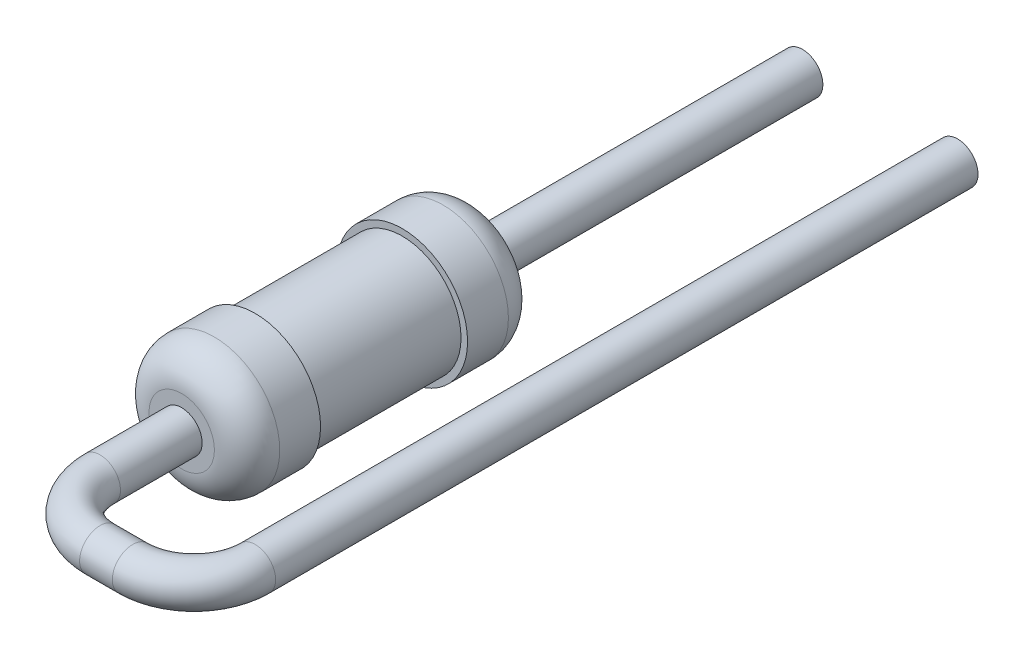
ISO-10303-21;
HEADER;
FILE_DESCRIPTION(('STEP AP214'),'2;1');
FILE_NAME('part.step','',(''),(''),'','','');
FILE_SCHEMA(('AUTOMOTIVE_DESIGN { 1 0 10303 214 1 1 1 1 }'));
ENDSEC;
DATA;
#1=APPLICATION_CONTEXT('core data for automotive mechanical design processes');
#2=APPLICATION_PROTOCOL_DEFINITION('international standard','automotive_design',2000,#1);
#3=PRODUCT_CONTEXT('',#1,'mechanical');
#4=PRODUCT('Part','Part','',(#3));
#5=PRODUCT_RELATED_PRODUCT_CATEGORY('part','',(#4));
#6=PRODUCT_DEFINITION_FORMATION('','',#4);
#7=PRODUCT_DEFINITION_CONTEXT('part definition',#1,'design');
#8=PRODUCT_DEFINITION('design','',#6,#7);
#9=PRODUCT_DEFINITION_SHAPE('','',#8);
#10=(LENGTH_UNIT() NAMED_UNIT(*) SI_UNIT(.MILLI.,.METRE.));
#11=(NAMED_UNIT(*) PLANE_ANGLE_UNIT() SI_UNIT($,.RADIAN.));
#12=(NAMED_UNIT(*) SI_UNIT($,.STERADIAN.) SOLID_ANGLE_UNIT());
#13=UNCERTAINTY_MEASURE_WITH_UNIT(LENGTH_MEASURE(1.E-05),#10,'distance_accuracy_value','');
#14=(GEOMETRIC_REPRESENTATION_CONTEXT(3) GLOBAL_UNCERTAINTY_ASSIGNED_CONTEXT((#13)) GLOBAL_UNIT_ASSIGNED_CONTEXT((#10,
#11,#12)) REPRESENTATION_CONTEXT('',''));
#15=CARTESIAN_POINT('',(0.,0.,0.));
#16=DIRECTION('',(0.,0.,1.));
#17=DIRECTION('',(1.,0.,0.));
#18=AXIS2_PLACEMENT_3D('',#15,#16,#17);
#19=CARTESIAN_POINT('',(1.65,0.,-3.));
#20=DIRECTION('',(0.,0.,1.));
#21=DIRECTION('',(1.,0.,0.));
#22=AXIS2_PLACEMENT_3D('',#19,#20,#21);
#23=PLANE('',#22);
#24=CARTESIAN_POINT('',(1.9,0.,-3.));
#25=DIRECTION('',(0.,0.,-1.));
#26=DIRECTION('',(-1.,0.,0.));
#27=AXIS2_PLACEMENT_3D('',#24,#25,#26);
#28=CIRCLE('',#27,0.25);
#29=CARTESIAN_POINT('',(1.65,0.,-3.));
#30=VERTEX_POINT('',#29);
#31=EDGE_CURVE('E10',#30,#30,#28,.T.);
#32=ORIENTED_EDGE('',*,*,#31,.T.);
#33=EDGE_LOOP('',(#32));
#34=FACE_BOUND('',#33,.T.);
#35=ADVANCED_FACE('F15',(#34),#23,.F.);
#36=CARTESIAN_POINT('',(1.9,0.,5.6));
#37=DIRECTION('',(0.,0.,-1.));
#38=DIRECTION('',(-1.,0.,0.));
#39=AXIS2_PLACEMENT_3D('',#36,#37,#38);
#40=CYLINDRICAL_SURFACE('',#39,0.25);
#41=ORIENTED_EDGE('',*,*,#31,.F.);
#42=EDGE_LOOP('',(#41));
#43=FACE_BOUND('',#42,.T.);
#44=CARTESIAN_POINT('',(1.9,0.,5.6));
#45=DIRECTION('',(0.,0.,1.));
#46=DIRECTION('',(1.,0.,0.));
#47=AXIS2_PLACEMENT_3D('',#44,#45,#46);
#48=CIRCLE('',#47,0.25);
#49=CARTESIAN_POINT('',(2.15,0.,5.6));
#50=VERTEX_POINT('',#49);
#51=EDGE_CURVE('E22',#50,#50,#48,.T.);
#52=ORIENTED_EDGE('',*,*,#51,.F.);
#53=EDGE_LOOP('',(#52));
#54=FACE_BOUND('',#53,.T.);
#55=ADVANCED_FACE('F111',(#43,#54),#40,.T.);
#56=CARTESIAN_POINT('',(1.15,0.,5.6));
#57=DIRECTION('',(0.,1.,0.));
#58=DIRECTION('',(0.,0.,1.));
#59=AXIS2_PLACEMENT_3D('',#56,#57,#58);
#60=TOROIDAL_SURFACE('',#59,0.75,0.25);
#61=CARTESIAN_POINT('',(1.15,0.,6.35));
#62=DIRECTION('',(1.,0.,0.));
#63=DIRECTION('',(0.,0.,-1.));
#64=AXIS2_PLACEMENT_3D('',#61,#62,#63);
#65=CIRCLE('',#64,0.25);
#66=CARTESIAN_POINT('',(1.15,0.,6.6));
#67=VERTEX_POINT('',#66);
#68=EDGE_CURVE('E30',#67,#67,#65,.T.);
#69=CARTESIAN_POINT('',(1.15,0.,5.6));
#70=DIRECTION('',(0.,1.,0.));
#71=DIRECTION('',(0.,0.,1.));
#72=AXIS2_PLACEMENT_3D('',#69,#70,#71);
#73=CIRCLE('',#72,1.);
#74=EDGE_CURVE('',#67,#50,#73,.T.);
#75=ORIENTED_EDGE('',*,*,#68,.T.);
#76=ORIENTED_EDGE('',*,*,#51,.T.);
#77=ORIENTED_EDGE('',*,*,#74,.T.);
#78=ORIENTED_EDGE('',*,*,#74,.F.);
#79=EDGE_LOOP('',(#75,#77,#76,#78));
#80=FACE_BOUND('',#79,.T.);
#81=ADVANCED_FACE('F116',(#80),#60,.T.);
#82=CARTESIAN_POINT('',(0.75,0.,6.35));
#83=DIRECTION('',(1.,0.,0.));
#84=DIRECTION('',(0.,0.,-1.));
#85=AXIS2_PLACEMENT_3D('',#82,#83,#84);
#86=CYLINDRICAL_SURFACE('',#85,0.25);
#87=ORIENTED_EDGE('',*,*,#68,.F.);
#88=EDGE_LOOP('',(#87));
#89=FACE_BOUND('',#88,.T.);
#90=CARTESIAN_POINT('',(0.75,0.,6.35));
#91=DIRECTION('',(-1.,0.,0.));
#92=DIRECTION('',(0.,0.,1.));
#93=AXIS2_PLACEMENT_3D('',#90,#91,#92);
#94=CIRCLE('',#93,0.25);
#95=CARTESIAN_POINT('',(0.75,0.,6.6));
#96=VERTEX_POINT('',#95);
#97=EDGE_CURVE('E37',#96,#96,#94,.T.);
#98=ORIENTED_EDGE('',*,*,#97,.F.);
#99=EDGE_LOOP('',(#98));
#100=FACE_BOUND('',#99,.T.);
#101=ADVANCED_FACE('F122',(#89,#100),#86,.T.);
#102=CARTESIAN_POINT('',(0.75,0.,5.6));
#103=DIRECTION('',(0.,1.,0.));
#104=DIRECTION('',(-1.,0.,0.));
#105=AXIS2_PLACEMENT_3D('',#102,#103,#104);
#106=TOROIDAL_SURFACE('',#105,0.75,0.25);
#107=CARTESIAN_POINT('',(0.,0.,5.6));
#108=DIRECTION('',(0.,0.,1.));
#109=DIRECTION('',(1.,0.,0.));
#110=AXIS2_PLACEMENT_3D('',#107,#108,#109);
#111=CIRCLE('',#110,0.25);
#112=CARTESIAN_POINT('',(-0.25,0.,5.6));
#113=VERTEX_POINT('',#112);
#114=EDGE_CURVE('E42',#113,#113,#111,.T.);
#115=CARTESIAN_POINT('',(0.75,0.,5.6));
#116=DIRECTION('',(0.,1.,0.));
#117=DIRECTION('',(-1.,0.,0.));
#118=AXIS2_PLACEMENT_3D('',#115,#116,#117);
#119=CIRCLE('',#118,1.);
#120=EDGE_CURVE('',#113,#96,#119,.T.);
#121=ORIENTED_EDGE('',*,*,#114,.T.);
#122=ORIENTED_EDGE('',*,*,#97,.T.);
#123=ORIENTED_EDGE('',*,*,#120,.T.);
#124=ORIENTED_EDGE('',*,*,#120,.F.);
#125=EDGE_LOOP('',(#121,#123,#122,#124));
#126=FACE_BOUND('',#125,.T.);
#127=ADVANCED_FACE('F156',(#126),#106,.T.);
#128=CARTESIAN_POINT('',(0.,0.,-3.));
#129=DIRECTION('',(0.,0.,1.));
#130=DIRECTION('',(1.,0.,0.));
#131=AXIS2_PLACEMENT_3D('',#128,#129,#130);
#132=CYLINDRICAL_SURFACE('',#131,0.25);
#133=ORIENTED_EDGE('',*,*,#114,.F.);
#134=EDGE_LOOP('',(#133));
#135=FACE_BOUND('',#134,.T.);
#136=CARTESIAN_POINT('',(0.,0.,4.6));
#137=DIRECTION('',(0.,0.,1.));
#138=DIRECTION('',(1.,0.,0.));
#139=AXIS2_PLACEMENT_3D('',#136,#137,#138);
#140=CIRCLE('',#139,0.25);
#141=CARTESIAN_POINT('',(0.25,0.,4.6));
#142=VERTEX_POINT('',#141);
#143=EDGE_CURVE('E46',#142,#142,#140,.T.);
#144=ORIENTED_EDGE('',*,*,#143,.T.);
#145=EDGE_LOOP('',(#144));
#146=FACE_BOUND('',#145,.T.);
#147=ADVANCED_FACE('F146',(#135,#146),#132,.T.);
#148=CARTESIAN_POINT('',(0.8,0.,4.6));
#149=DIRECTION('',(0.,0.,-1.));
#150=DIRECTION('',(0.,-1.,0.));
#151=AXIS2_PLACEMENT_3D('',#148,#149,#150);
#152=PLANE('',#151);
#153=ORIENTED_EDGE('',*,*,#143,.F.);
#154=EDGE_LOOP('',(#153));
#155=FACE_BOUND('',#154,.T.);
#156=CARTESIAN_POINT('',(0.,0.,4.6));
#157=DIRECTION('',(0.,0.,1.));
#158=DIRECTION('',(1.,0.,0.));
#159=AXIS2_PLACEMENT_3D('',#156,#157,#158);
#160=CIRCLE('',#159,0.4);
#161=CARTESIAN_POINT('',(0.4,0.,4.6));
#162=VERTEX_POINT('',#161);
#163=EDGE_CURVE('E50',#162,#162,#160,.T.);
#164=ORIENTED_EDGE('',*,*,#163,.T.);
#165=EDGE_LOOP('',(#164));
#166=FACE_BOUND('',#165,.T.);
#167=ADVANCED_FACE('F142',(#155,#166),#152,.F.);
#168=CARTESIAN_POINT('',(0.,0.,4.2));
#169=DIRECTION('',(0.,0.,1.));
#170=DIRECTION('',(1.,0.,0.));
#171=AXIS2_PLACEMENT_3D('',#168,#169,#170);
#172=DEGENERATE_TOROIDAL_SURFACE('',#171,0.4,0.4,.T.);
#173=ORIENTED_EDGE('',*,*,#163,.F.);
#174=EDGE_LOOP('',(#173));
#175=FACE_BOUND('',#174,.T.);
#176=CARTESIAN_POINT('',(0.,0.,4.2));
#177=DIRECTION('',(0.,0.,1.));
#178=DIRECTION('',(1.,0.,0.));
#179=AXIS2_PLACEMENT_3D('',#176,#177,#178);
#180=CIRCLE('',#179,0.8);
#181=CARTESIAN_POINT('',(0.8,0.,4.2));
#182=VERTEX_POINT('',#181);
#183=EDGE_CURVE('E51',#182,#182,#180,.T.);
#184=ORIENTED_EDGE('',*,*,#183,.T.);
#185=EDGE_LOOP('',(#184));
#186=FACE_BOUND('',#185,.T.);
#187=ADVANCED_FACE('F145',(#175,#186),#172,.T.);
#188=CARTESIAN_POINT('',(0.,0.,3.7));
#189=DIRECTION('',(0.,0.,-1.));
#190=DIRECTION('',(1.,0.,0.));
#191=AXIS2_PLACEMENT_3D('',#188,#189,#190);
#192=CYLINDRICAL_SURFACE('',#191,0.8);
#193=ORIENTED_EDGE('',*,*,#183,.F.);
#194=EDGE_LOOP('',(#193));
#195=FACE_BOUND('',#194,.T.);
#196=CARTESIAN_POINT('',(0.,0.,3.7));
#197=DIRECTION('',(0.,0.,1.));
#198=DIRECTION('',(1.,0.,0.));
#199=AXIS2_PLACEMENT_3D('',#196,#197,#198);
#200=CIRCLE('',#199,0.8);
#201=CARTESIAN_POINT('',(0.8,0.,3.7));
#202=VERTEX_POINT('',#201);
#203=EDGE_CURVE('E54',#202,#202,#200,.T.);
#204=ORIENTED_EDGE('',*,*,#203,.T.);
#205=EDGE_LOOP('',(#204));
#206=FACE_BOUND('',#205,.T.);
#207=ADVANCED_FACE('F140',(#195,#206),#192,.T.);
#208=CARTESIAN_POINT('',(0.25,0.,-3.));
#209=DIRECTION('',(0.,0.,-1.));
#210=DIRECTION('',(0.,-1.,0.));
#211=AXIS2_PLACEMENT_3D('',#208,#209,#210);
#212=PLANE('',#211);
#213=CARTESIAN_POINT('',(0.,0.,-3.));
#214=DIRECTION('',(0.,0.,1.));
#215=DIRECTION('',(1.,0.,0.));
#216=AXIS2_PLACEMENT_3D('',#213,#214,#215);
#217=CIRCLE('',#216,0.25);
#218=CARTESIAN_POINT('',(0.25,0.,-3.));
#219=VERTEX_POINT('',#218);
#220=EDGE_CURVE('E59',#219,#219,#217,.T.);
#221=ORIENTED_EDGE('',*,*,#220,.F.);
#222=EDGE_LOOP('',(#221));
#223=FACE_BOUND('',#222,.T.);
#224=ADVANCED_FACE('F136',(#223),#212,.T.);
#225=CARTESIAN_POINT('',(0.8,0.,3.7));
#226=DIRECTION('',(0.,0.,-1.));
#227=DIRECTION('',(0.,-1.,0.));
#228=AXIS2_PLACEMENT_3D('',#225,#226,#227);
#229=PLANE('',#228);
#230=CARTESIAN_POINT('',(0.,0.,3.7));
#231=DIRECTION('',(0.,0.,-1.));
#232=DIRECTION('',(1.,0.,0.));
#233=AXIS2_PLACEMENT_3D('',#230,#231,#232);
#234=CIRCLE('',#233,0.72);
#235=CARTESIAN_POINT('',(0.72,0.,3.7));
#236=VERTEX_POINT('',#235);
#237=EDGE_CURVE('E67',#236,#236,#234,.T.);
#238=ORIENTED_EDGE('',*,*,#237,.F.);
#239=EDGE_LOOP('',(#238));
#240=FACE_BOUND('',#239,.T.);
#241=ORIENTED_EDGE('',*,*,#203,.F.);
#242=EDGE_LOOP('',(#241));
#243=FACE_BOUND('',#242,.T.);
#244=ADVANCED_FACE('F133',(#240,#243),#229,.T.);
#245=CARTESIAN_POINT('',(0.,0.,-3.));
#246=DIRECTION('',(0.,0.,1.));
#247=DIRECTION('',(1.,0.,0.));
#248=AXIS2_PLACEMENT_3D('',#245,#246,#247);
#249=CYLINDRICAL_SURFACE('',#248,0.25);
#250=CARTESIAN_POINT('',(0.,0.,1.));
#251=DIRECTION('',(0.,0.,1.));
#252=DIRECTION('',(1.,0.,0.));
#253=AXIS2_PLACEMENT_3D('',#250,#251,#252);
#254=CIRCLE('',#253,0.25);
#255=CARTESIAN_POINT('',(0.25,0.,1.));
#256=VERTEX_POINT('',#255);
#257=EDGE_CURVE('E63',#256,#256,#254,.T.);
#258=ORIENTED_EDGE('',*,*,#257,.F.);
#259=EDGE_LOOP('',(#258));
#260=FACE_BOUND('',#259,.T.);
#261=ORIENTED_EDGE('',*,*,#220,.T.);
#262=EDGE_LOOP('',(#261));
#263=FACE_BOUND('',#262,.T.);
#264=ADVANCED_FACE('F131',(#260,#263),#249,.T.);
#265=CARTESIAN_POINT('',(0.,0.,1.));
#266=DIRECTION('',(0.,0.,-1.));
#267=DIRECTION('',(1.,0.,0.));
#268=AXIS2_PLACEMENT_3D('',#265,#266,#267);
#269=CYLINDRICAL_SURFACE('',#268,0.72);
#270=ORIENTED_EDGE('',*,*,#237,.T.);
#271=EDGE_LOOP('',(#270));
#272=FACE_BOUND('',#271,.T.);
#273=CARTESIAN_POINT('',(0.,0.,1.9));
#274=DIRECTION('',(0.,0.,-1.));
#275=DIRECTION('',(1.,0.,0.));
#276=AXIS2_PLACEMENT_3D('',#273,#274,#275);
#277=CIRCLE('',#276,0.72);
#278=CARTESIAN_POINT('',(0.72,0.,1.9));
#279=VERTEX_POINT('',#278);
#280=EDGE_CURVE('E68',#279,#279,#277,.T.);
#281=ORIENTED_EDGE('',*,*,#280,.F.);
#282=EDGE_LOOP('',(#281));
#283=FACE_BOUND('',#282,.T.);
#284=ADVANCED_FACE('F127',(#272,#283),#269,.T.);
#285=CARTESIAN_POINT('',(0.8,0.,1.));
#286=DIRECTION('',(0.,0.,-1.));
#287=DIRECTION('',(0.,-1.,0.));
#288=AXIS2_PLACEMENT_3D('',#285,#286,#287);
#289=PLANE('',#288);
#290=ORIENTED_EDGE('',*,*,#257,.T.);
#291=EDGE_LOOP('',(#290));
#292=FACE_BOUND('',#291,.T.);
#293=CARTESIAN_POINT('',(0.,0.,1.));
#294=DIRECTION('',(0.,0.,1.));
#295=DIRECTION('',(1.,0.,0.));
#296=AXIS2_PLACEMENT_3D('',#293,#294,#295);
#297=CIRCLE('',#296,0.4);
#298=CARTESIAN_POINT('',(0.4,0.,1.));
#299=VERTEX_POINT('',#298);
#300=EDGE_CURVE('E75',#299,#299,#297,.T.);
#301=ORIENTED_EDGE('',*,*,#300,.F.);
#302=EDGE_LOOP('',(#301));
#303=FACE_BOUND('',#302,.T.);
#304=ADVANCED_FACE('F106',(#292,#303),#289,.T.);
#305=CARTESIAN_POINT('',(0.8,0.,1.9));
#306=DIRECTION('',(0.,0.,-1.));
#307=DIRECTION('',(0.,-1.,0.));
#308=AXIS2_PLACEMENT_3D('',#305,#306,#307);
#309=PLANE('',#308);
#310=ORIENTED_EDGE('',*,*,#280,.T.);
#311=EDGE_LOOP('',(#310));
#312=FACE_BOUND('',#311,.T.);
#313=CARTESIAN_POINT('',(0.,0.,1.9));
#314=DIRECTION('',(0.,0.,1.));
#315=DIRECTION('',(1.,0.,0.));
#316=AXIS2_PLACEMENT_3D('',#313,#314,#315);
#317=CIRCLE('',#316,0.8);
#318=CARTESIAN_POINT('',(0.8,0.,1.9));
#319=VERTEX_POINT('',#318);
#320=EDGE_CURVE('E79',#319,#319,#317,.T.);
#321=ORIENTED_EDGE('',*,*,#320,.T.);
#322=EDGE_LOOP('',(#321));
#323=FACE_BOUND('',#322,.T.);
#324=ADVANCED_FACE('F96',(#312,#323),#309,.F.);
#325=CARTESIAN_POINT('',(0.,0.,1.4));
#326=DIRECTION('',(0.,0.,-1.));
#327=DIRECTION('',(1.,0.,0.));
#328=AXIS2_PLACEMENT_3D('',#325,#326,#327);
#329=DEGENERATE_TOROIDAL_SURFACE('',#328,0.4,0.4,.T.);
#330=ORIENTED_EDGE('',*,*,#300,.T.);
#331=EDGE_LOOP('',(#330));
#332=FACE_BOUND('',#331,.T.);
#333=CARTESIAN_POINT('',(0.,0.,1.4));
#334=DIRECTION('',(0.,0.,1.));
#335=DIRECTION('',(1.,0.,0.));
#336=AXIS2_PLACEMENT_3D('',#333,#334,#335);
#337=CIRCLE('',#336,0.8);
#338=CARTESIAN_POINT('',(0.8,0.,1.4));
#339=VERTEX_POINT('',#338);
#340=EDGE_CURVE('E83',#339,#339,#337,.T.);
#341=ORIENTED_EDGE('',*,*,#340,.F.);
#342=EDGE_LOOP('',(#341));
#343=FACE_BOUND('',#342,.T.);
#344=ADVANCED_FACE('F94',(#332,#343),#329,.T.);
#345=CARTESIAN_POINT('',(0.,0.,1.));
#346=DIRECTION('',(0.,0.,-1.));
#347=DIRECTION('',(1.,0.,0.));
#348=AXIS2_PLACEMENT_3D('',#345,#346,#347);
#349=CYLINDRICAL_SURFACE('',#348,0.8);
#350=ORIENTED_EDGE('',*,*,#320,.F.);
#351=EDGE_LOOP('',(#350));
#352=FACE_BOUND('',#351,.T.);
#353=ORIENTED_EDGE('',*,*,#340,.T.);
#354=EDGE_LOOP('',(#353));
#355=FACE_BOUND('',#354,.T.);
#356=ADVANCED_FACE('F92',(#352,#355),#349,.T.);
#357=CLOSED_SHELL('',(#35,#55,#81,#101,#127,#147,#167,#187,#207,#224,#244,#264,#284,#304,#324,
#344,#356));
#358=MANIFOLD_SOLID_BREP('B1',#357);
#359=ADVANCED_BREP_SHAPE_REPRESENTATION('',(#18,#358),#14);
#360=SHAPE_DEFINITION_REPRESENTATION(#9,#359);
ENDSEC;
END-ISO-10303-21;
